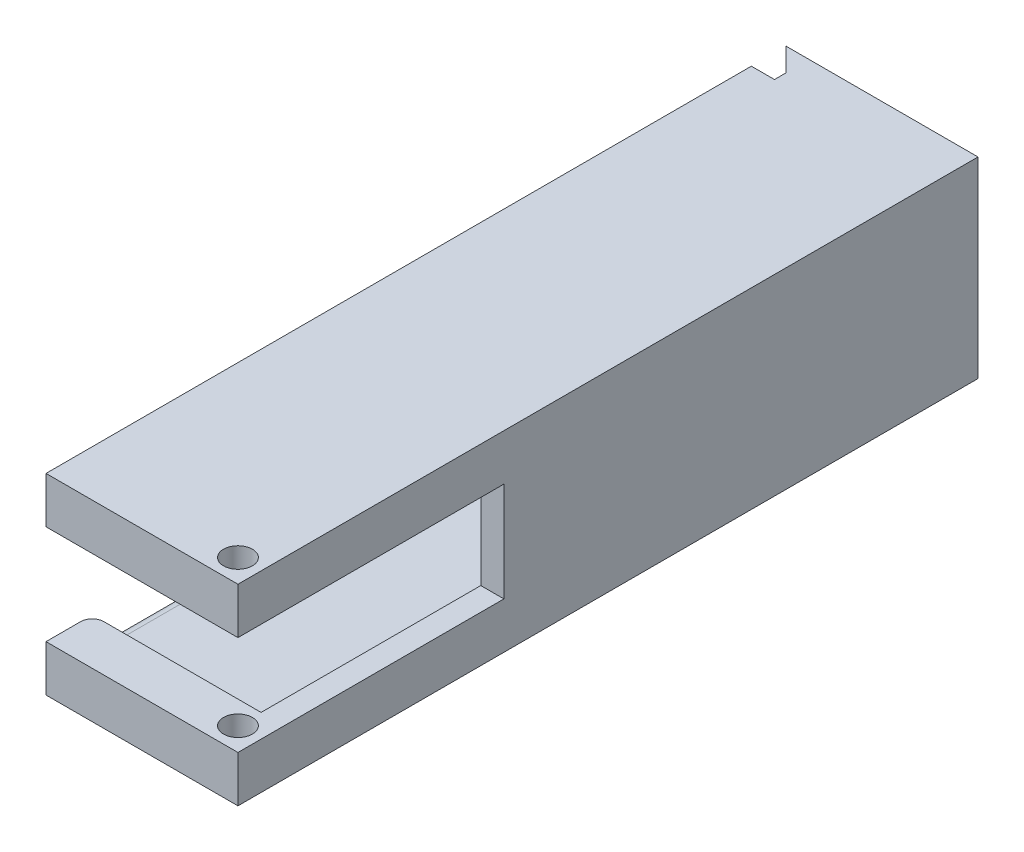
ISO-10303-21;
HEADER;
FILE_DESCRIPTION(('STEP AP214'),'2;1');
FILE_NAME('part.step','',(''),(''),'','','');
FILE_SCHEMA(('AUTOMOTIVE_DESIGN { 1 0 10303 214 1 1 1 1 }'));
ENDSEC;
DATA;
#1=APPLICATION_CONTEXT('core data for automotive mechanical design processes');
#2=APPLICATION_PROTOCOL_DEFINITION('international standard','automotive_design',2000,#1);
#3=PRODUCT_CONTEXT('',#1,'mechanical');
#4=PRODUCT('Part','Part','',(#3));
#5=PRODUCT_RELATED_PRODUCT_CATEGORY('part','',(#4));
#6=PRODUCT_DEFINITION_FORMATION('','',#4);
#7=PRODUCT_DEFINITION_CONTEXT('part definition',#1,'design');
#8=PRODUCT_DEFINITION('design','',#6,#7);
#9=PRODUCT_DEFINITION_SHAPE('','',#8);
#10=(LENGTH_UNIT() NAMED_UNIT(*) SI_UNIT(.MILLI.,.METRE.));
#11=(NAMED_UNIT(*) PLANE_ANGLE_UNIT() SI_UNIT($,.RADIAN.));
#12=(NAMED_UNIT(*) SI_UNIT($,.STERADIAN.) SOLID_ANGLE_UNIT());
#13=UNCERTAINTY_MEASURE_WITH_UNIT(LENGTH_MEASURE(1.E-05),#10,'distance_accuracy_value','');
#14=(GEOMETRIC_REPRESENTATION_CONTEXT(3) GLOBAL_UNCERTAINTY_ASSIGNED_CONTEXT((#13)) GLOBAL_UNIT_ASSIGNED_CONTEXT((#10,
#11,#12)) REPRESENTATION_CONTEXT('',''));
#15=CARTESIAN_POINT('',(0.,0.,0.));
#16=DIRECTION('',(0.,0.,1.));
#17=DIRECTION('',(1.,0.,0.));
#18=AXIS2_PLACEMENT_3D('',#15,#16,#17);
#19=CARTESIAN_POINT('',(0.,-2.,0.));
#20=DIRECTION('',(-1.,0.,0.));
#21=DIRECTION('',(0.,0.,1.));
#22=AXIS2_PLACEMENT_3D('',#19,#20,#21);
#23=PLANE('',#22);
#24=DIRECTION('',(0.,0.,1.));
#25=VECTOR('',#24,1.);
#26=CARTESIAN_POINT('',(0.,14.6,-60.));
#27=LINE('',#26,#25);
#28=CARTESIAN_POINT('',(0.,14.6,-57.));
#29=VERTEX_POINT('',#28);
#30=CARTESIAN_POINT('',(0.,14.6,4.));
#31=VERTEX_POINT('',#30);
#32=EDGE_CURVE('E280',#29,#31,#27,.T.);
#33=ORIENTED_EDGE('',*,*,#32,.F.);
#34=DIRECTION('',(0.,-1.,0.));
#35=VECTOR('',#34,1.);
#36=CARTESIAN_POINT('',(0.,19.,-57.));
#37=LINE('',#36,#35);
#38=CARTESIAN_POINT('',(0.,10.6,-57.));
#39=VERTEX_POINT('',#38);
#40=EDGE_CURVE('E619',#29,#39,#37,.T.);
#41=ORIENTED_EDGE('',*,*,#40,.T.);
#42=DIRECTION('',(0.,0.,-1.));
#43=VECTOR('',#42,1.);
#44=CARTESIAN_POINT('',(0.,10.6,0.));
#45=LINE('',#44,#43);
#46=CARTESIAN_POINT('',(0.,10.6,-20.999));
#47=VERTEX_POINT('',#46);
#48=EDGE_CURVE('E478',#47,#39,#45,.T.);
#49=ORIENTED_EDGE('',*,*,#48,.F.);
#50=CARTESIAN_POINT('',(0.,12.599,-20.999));
#51=DIRECTION('',(-1.,0.,0.));
#52=DIRECTION('',(0.,0.,1.));
#53=AXIS2_PLACEMENT_3D('',#50,#51,#52);
#54=CIRCLE('',#53,1.999);
#55=CARTESIAN_POINT('',(0.,12.599,-19.));
#56=VERTEX_POINT('',#55);
#57=EDGE_CURVE('E464',#56,#47,#54,.F.);
#58=ORIENTED_EDGE('',*,*,#57,.F.);
#59=DIRECTION('',(0.,-1.,0.));
#60=VECTOR('',#59,1.);
#61=CARTESIAN_POINT('',(0.,12.6,-19.));
#62=LINE('',#61,#60);
#63=CARTESIAN_POINT('',(0.,13.6,-19.));
#64=VERTEX_POINT('',#63);
#65=EDGE_CURVE('E555',#64,#56,#62,.T.);
#66=ORIENTED_EDGE('',*,*,#65,.F.);
#67=DIRECTION('',(0.,0.,1.));
#68=VECTOR('',#67,1.);
#69=CARTESIAN_POINT('',(0.,13.6,0.));
#70=LINE('',#69,#68);
#71=CARTESIAN_POINT('',(0.,13.6,1.));
#72=VERTEX_POINT('',#71);
#73=EDGE_CURVE('E331',#64,#72,#70,.T.);
#74=ORIENTED_EDGE('',*,*,#73,.T.);
#75=DIRECTION('',(0.,-1.,0.));
#76=VECTOR('',#75,1.);
#77=CARTESIAN_POINT('',(0.,-2.,1.));
#78=LINE('',#77,#76);
#79=CARTESIAN_POINT('',(0.,10.6,1.));
#80=VERTEX_POINT('',#79);
#81=EDGE_CURVE('E322',#72,#80,#78,.T.);
#82=ORIENTED_EDGE('',*,*,#81,.T.);
#83=DIRECTION('',(0.,0.,1.));
#84=VECTOR('',#83,1.);
#85=CARTESIAN_POINT('',(0.,10.6,0.));
#86=LINE('',#85,#84);
#87=CARTESIAN_POINT('',(0.,10.6,4.));
#88=VERTEX_POINT('',#87);
#89=EDGE_CURVE('E448',#80,#88,#86,.T.);
#90=ORIENTED_EDGE('',*,*,#89,.T.);
#91=DIRECTION('',(0.,-1.,0.));
#92=VECTOR('',#91,1.);
#93=CARTESIAN_POINT('',(0.,10.6,4.));
#94=LINE('',#93,#92);
#95=EDGE_CURVE('E400',#31,#88,#94,.T.);
#96=ORIENTED_EDGE('',*,*,#95,.F.);
#97=EDGE_LOOP('',(#33,#41,#49,#58,#66,#74,#82,#90,#96));
#98=FACE_BOUND('',#97,.T.);
#99=ADVANCED_FACE('F71',(#98),#23,.T.);
#100=DIRECTION('',(0.,0.,-1.));
#101=VECTOR('',#100,1.);
#102=CARTESIAN_POINT('',(0.,2.,0.));
#103=LINE('',#102,#101);
#104=CARTESIAN_POINT('',(0.,2.,-20.999));
#105=VERTEX_POINT('',#104);
#106=CARTESIAN_POINT('',(0.,1.99999999999999,-57.));
#107=VERTEX_POINT('',#106);
#108=EDGE_CURVE('E497',#105,#107,#103,.T.);
#109=ORIENTED_EDGE('',*,*,#108,.T.);
#110=CARTESIAN_POINT('',(0.,-2.,-57.));
#111=VERTEX_POINT('',#110);
#112=EDGE_CURVE('E605',#107,#111,#37,.T.);
#113=ORIENTED_EDGE('',*,*,#112,.T.);
#114=DIRECTION('',(0.,0.,1.));
#115=VECTOR('',#114,1.);
#116=CARTESIAN_POINT('',(0.,-2.,0.));
#117=LINE('',#116,#115);
#118=CARTESIAN_POINT('',(0.,-2.,4.));
#119=VERTEX_POINT('',#118);
#120=EDGE_CURVE('E307',#111,#119,#117,.T.);
#121=ORIENTED_EDGE('',*,*,#120,.T.);
#122=DIRECTION('',(0.,-1.,0.));
#123=VECTOR('',#122,1.);
#124=CARTESIAN_POINT('',(0.,-2.,4.));
#125=LINE('',#124,#123);
#126=CARTESIAN_POINT('',(0.,2.,4.));
#127=VERTEX_POINT('',#126);
#128=EDGE_CURVE('E424',#127,#119,#125,.T.);
#129=ORIENTED_EDGE('',*,*,#128,.F.);
#130=DIRECTION('',(0.,0.,1.));
#131=VECTOR('',#130,1.);
#132=CARTESIAN_POINT('',(0.,2.,0.));
#133=LINE('',#132,#131);
#134=CARTESIAN_POINT('',(0.,2.,1.));
#135=VERTEX_POINT('',#134);
#136=EDGE_CURVE('E458',#135,#127,#133,.T.);
#137=ORIENTED_EDGE('',*,*,#136,.F.);
#138=DIRECTION('',(0.,-1.,0.));
#139=VECTOR('',#138,1.);
#140=CARTESIAN_POINT('',(0.,-2.,1.));
#141=LINE('',#140,#139);
#142=CARTESIAN_POINT('',(0.,-1.,1.));
#143=VERTEX_POINT('',#142);
#144=EDGE_CURVE('E348',#135,#143,#141,.T.);
#145=ORIENTED_EDGE('',*,*,#144,.T.);
#146=DIRECTION('',(0.,0.,1.));
#147=VECTOR('',#146,1.);
#148=CARTESIAN_POINT('',(0.,-1.,0.));
#149=LINE('',#148,#147);
#150=CARTESIAN_POINT('',(0.,-1.,-19.));
#151=VERTEX_POINT('',#150);
#152=EDGE_CURVE('E344',#143,#151,#149,.F.);
#153=ORIENTED_EDGE('',*,*,#152,.T.);
#154=CARTESIAN_POINT('',(0.,0.000999999999972811,-19.));
#155=VERTEX_POINT('',#154);
#156=EDGE_CURVE('E554',#155,#151,#62,.T.);
#157=ORIENTED_EDGE('',*,*,#156,.F.);
#158=CARTESIAN_POINT('',(0.,0.000999999999987556,-20.999));
#159=DIRECTION('',(-1.,0.,0.));
#160=DIRECTION('',(0.,0.,1.));
#161=AXIS2_PLACEMENT_3D('',#158,#159,#160);
#162=CIRCLE('',#161,1.999);
#163=EDGE_CURVE('E470',#105,#155,#162,.F.);
#164=ORIENTED_EDGE('',*,*,#163,.F.);
#165=EDGE_LOOP('',(#109,#113,#121,#129,#137,#145,#153,#157,#164));
#166=FACE_BOUND('',#165,.T.);
#167=ADVANCED_FACE('F682',(#166),#23,.T.);
#168=CARTESIAN_POINT('',(2.00000000000004,12.6,0.));
#169=DIRECTION('',(-1.,0.,0.));
#170=DIRECTION('',(0.,0.,1.));
#171=AXIS2_PLACEMENT_3D('',#168,#169,#170);
#172=PLANE('',#171);
#173=DIRECTION('',(0.,-1.,0.));
#174=VECTOR('',#173,1.);
#175=CARTESIAN_POINT('',(2.,19.,-57.));
#176=LINE('',#175,#174);
#177=CARTESIAN_POINT('',(2.,1.99999999999999,-57.));
#178=VERTEX_POINT('',#177);
#179=CARTESIAN_POINT('',(2.,0.,-57.));
#180=VERTEX_POINT('',#179);
#181=EDGE_CURVE('E94',#178,#180,#176,.T.);
#182=ORIENTED_EDGE('',*,*,#181,.F.);
#183=DIRECTION('',(0.,0.,-1.));
#184=VECTOR('',#183,1.);
#185=CARTESIAN_POINT('',(2.,2.,0.));
#186=LINE('',#185,#184);
#187=CARTESIAN_POINT('',(1.99999999999997,2.,-20.999));
#188=VERTEX_POINT('',#187);
#189=EDGE_CURVE('E281',#188,#178,#186,.T.);
#190=ORIENTED_EDGE('',*,*,#189,.F.);
#191=CARTESIAN_POINT('',(1.99999999999997,0.000999999999987556,-20.999));
#192=DIRECTION('',(-1.,0.,0.));
#193=DIRECTION('',(0.,0.,1.));
#194=AXIS2_PLACEMENT_3D('',#191,#192,#193);
#195=CIRCLE('',#194,1.999);
#196=CARTESIAN_POINT('',(1.99999999999997,0.000999999999972811,-19.));
#197=VERTEX_POINT('',#196);
#198=EDGE_CURVE('E465',#188,#197,#195,.F.);
#199=ORIENTED_EDGE('',*,*,#198,.T.);
#200=DIRECTION('',(0.,-1.,0.));
#201=VECTOR('',#200,1.);
#202=CARTESIAN_POINT('',(2.00000000000003,12.6,-19.));
#203=LINE('',#202,#201);
#204=CARTESIAN_POINT('',(2.00000000000003,0.,-19.));
#205=VERTEX_POINT('',#204);
#206=EDGE_CURVE('E543',#197,#205,#203,.T.);
#207=ORIENTED_EDGE('',*,*,#206,.T.);
#208=DIRECTION('',(0.,0.,-1.));
#209=VECTOR('',#208,1.);
#210=CARTESIAN_POINT('',(2.00000000000004,0.,0.));
#211=LINE('',#210,#209);
#212=EDGE_CURVE('E539',#205,#180,#211,.T.);
#213=ORIENTED_EDGE('',*,*,#212,.T.);
#214=EDGE_LOOP('',(#182,#190,#199,#207,#213));
#215=FACE_BOUND('',#214,.T.);
#216=ADVANCED_FACE('F668',(#215),#172,.F.);
#217=CARTESIAN_POINT('',(2.,12.6,-57.));
#218=VERTEX_POINT('',#217);
#219=CARTESIAN_POINT('',(2.,10.6,-57.));
#220=VERTEX_POINT('',#219);
#221=EDGE_CURVE('E597',#218,#220,#176,.T.);
#222=ORIENTED_EDGE('',*,*,#221,.F.);
#223=DIRECTION('',(0.,0.,-1.));
#224=VECTOR('',#223,1.);
#225=CARTESIAN_POINT('',(2.00000000000004,12.6,0.));
#226=LINE('',#225,#224);
#227=CARTESIAN_POINT('',(2.00000000000003,12.6,-19.));
#228=VERTEX_POINT('',#227);
#229=EDGE_CURVE('E540',#228,#218,#226,.T.);
#230=ORIENTED_EDGE('',*,*,#229,.F.);
#231=CARTESIAN_POINT('',(1.99999999999997,12.599,-19.));
#232=VERTEX_POINT('',#231);
#233=EDGE_CURVE('E550',#228,#232,#203,.T.);
#234=ORIENTED_EDGE('',*,*,#233,.T.);
#235=CARTESIAN_POINT('',(1.99999999999997,12.599,-20.999));
#236=DIRECTION('',(-1.,0.,0.));
#237=DIRECTION('',(0.,0.,1.));
#238=AXIS2_PLACEMENT_3D('',#235,#236,#237);
#239=CIRCLE('',#238,1.999);
#240=CARTESIAN_POINT('',(1.99999999999997,10.6,-20.999));
#241=VERTEX_POINT('',#240);
#242=EDGE_CURVE('E481',#232,#241,#239,.F.);
#243=ORIENTED_EDGE('',*,*,#242,.T.);
#244=DIRECTION('',(0.,0.,-1.));
#245=VECTOR('',#244,1.);
#246=CARTESIAN_POINT('',(2.,10.6,0.));
#247=LINE('',#246,#245);
#248=EDGE_CURVE('E493',#241,#220,#247,.T.);
#249=ORIENTED_EDGE('',*,*,#248,.T.);
#250=EDGE_LOOP('',(#222,#230,#234,#243,#249));
#251=FACE_BOUND('',#250,.T.);
#252=ADVANCED_FACE('F596',(#251),#172,.F.);
#253=CARTESIAN_POINT('',(2.,10.6,0.));
#254=DIRECTION('',(0.,1.,0.));
#255=DIRECTION('',(0.,0.,1.));
#256=AXIS2_PLACEMENT_3D('',#253,#254,#255);
#257=PLANE('',#256);
#258=DIRECTION('',(-1.,0.,0.));
#259=VECTOR('',#258,1.);
#260=CARTESIAN_POINT('',(2.,10.6,-57.));
#261=LINE('',#260,#259);
#262=EDGE_CURVE('E371',#220,#39,#261,.T.);
#263=ORIENTED_EDGE('',*,*,#262,.F.);
#264=ORIENTED_EDGE('',*,*,#248,.F.);
#265=DIRECTION('',(-1.,0.,0.));
#266=VECTOR('',#265,1.);
#267=CARTESIAN_POINT('',(1.99999999999997,10.6,-20.999));
#268=LINE('',#267,#266);
#269=EDGE_CURVE('E473',#241,#47,#268,.T.);
#270=ORIENTED_EDGE('',*,*,#269,.T.);
#271=ORIENTED_EDGE('',*,*,#48,.T.);
#272=EDGE_LOOP('',(#263,#264,#270,#271));
#273=FACE_BOUND('',#272,.T.);
#274=ADVANCED_FACE('F954',(#273),#257,.F.);
#275=CARTESIAN_POINT('',(2.,2.,0.));
#276=DIRECTION('',(0.,1.,0.));
#277=DIRECTION('',(0.,0.,1.));
#278=AXIS2_PLACEMENT_3D('',#275,#276,#277);
#279=PLANE('',#278);
#280=ORIENTED_EDGE('',*,*,#189,.T.);
#281=DIRECTION('',(-1.,0.,0.));
#282=VECTOR('',#281,1.);
#283=CARTESIAN_POINT('',(2.,2.,-57.));
#284=LINE('',#283,#282);
#285=EDGE_CURVE('E379',#178,#107,#284,.T.);
#286=ORIENTED_EDGE('',*,*,#285,.T.);
#287=ORIENTED_EDGE('',*,*,#108,.F.);
#288=DIRECTION('',(-1.,0.,0.));
#289=VECTOR('',#288,1.);
#290=CARTESIAN_POINT('',(1.99999999999997,2.,-20.999));
#291=LINE('',#290,#289);
#292=EDGE_CURVE('E469',#188,#105,#291,.T.);
#293=ORIENTED_EDGE('',*,*,#292,.F.);
#294=EDGE_LOOP('',(#280,#286,#287,#293));
#295=FACE_BOUND('',#294,.T.);
#296=ADVANCED_FACE('F703',(#295),#279,.T.);
#297=CARTESIAN_POINT('',(0.,-2.,0.));
#298=DIRECTION('',(0.,1.,0.));
#299=DIRECTION('',(0.,0.,1.));
#300=AXIS2_PLACEMENT_3D('',#297,#298,#299);
#301=PLANE('',#300);
#302=CARTESIAN_POINT('',(14.6,-2.,2.));
#303=DIRECTION('',(0.,1.,0.));
#304=DIRECTION('',(0.,0.,1.));
#305=AXIS2_PLACEMENT_3D('',#302,#303,#304);
#306=CIRCLE('',#305,1.25);
#307=CARTESIAN_POINT('',(14.6,-2.,3.25));
#308=VERTEX_POINT('',#307);
#309=EDGE_CURVE('E396',#308,#308,#306,.T.);
#310=ORIENTED_EDGE('',*,*,#309,.T.);
#311=EDGE_LOOP('',(#310));
#312=FACE_BOUND('',#311,.T.);
#313=DIRECTION('',(1.,0.,0.));
#314=VECTOR('',#313,1.);
#315=CARTESIAN_POINT('',(0.,-2.,-57.));
#316=LINE('',#315,#314);
#317=CARTESIAN_POINT('',(2.,-2.,-57.));
#318=VERTEX_POINT('',#317);
#319=EDGE_CURVE('E615',#111,#318,#316,.T.);
#320=ORIENTED_EDGE('',*,*,#319,.T.);
#321=DIRECTION('',(0.,0.,1.));
#322=VECTOR('',#321,1.);
#323=CARTESIAN_POINT('',(2.00000000000001,-2.,0.));
#324=LINE('',#323,#322);
#325=CARTESIAN_POINT('',(2.,-2.,-57.999));
#326=VERTEX_POINT('',#325);
#327=EDGE_CURVE('E650',#326,#318,#324,.T.);
#328=ORIENTED_EDGE('',*,*,#327,.F.);
#329=DIRECTION('',(0.706930026593858,0.,0.707283491607154));
#330=VECTOR('',#329,1.);
#331=CARTESIAN_POINT('',(29.9999962518745,-2.,-29.9850037499996));
#332=LINE('',#331,#330);
#333=CARTESIAN_POINT('',(0.,-2.,-60.));
#334=VERTEX_POINT('',#333);
#335=EDGE_CURVE('E293',#334,#326,#332,.T.);
#336=ORIENTED_EDGE('',*,*,#335,.F.);
#337=DIRECTION('',(1.,0.,0.));
#338=VECTOR('',#337,1.);
#339=CARTESIAN_POINT('',(0.,-2.,-60.));
#340=LINE('',#339,#338);
#341=CARTESIAN_POINT('',(16.6,-2.,-60.));
#342=VERTEX_POINT('',#341);
#343=EDGE_CURVE('E559',#334,#342,#340,.T.);
#344=ORIENTED_EDGE('',*,*,#343,.T.);
#345=DIRECTION('',(0.,0.,1.));
#346=VECTOR('',#345,1.);
#347=CARTESIAN_POINT('',(16.6,-2.,0.));
#348=LINE('',#347,#346);
#349=CARTESIAN_POINT('',(16.6,-2.,4.));
#350=VERTEX_POINT('',#349);
#351=EDGE_CURVE('E301',#342,#350,#348,.T.);
#352=ORIENTED_EDGE('',*,*,#351,.T.);
#353=DIRECTION('',(1.,0.,0.));
#354=VECTOR('',#353,1.);
#355=CARTESIAN_POINT('',(16.6,-2.,4.));
#356=LINE('',#355,#354);
#357=EDGE_CURVE('E428',#119,#350,#356,.T.);
#358=ORIENTED_EDGE('',*,*,#357,.F.);
#359=ORIENTED_EDGE('',*,*,#120,.F.);
#360=EDGE_LOOP('',(#320,#328,#336,#344,#352,#358,#359));
#361=FACE_BOUND('',#360,.T.);
#362=ADVANCED_FACE('F646',(#312,#361),#301,.F.);
#363=CARTESIAN_POINT('',(0.,14.6,0.));
#364=DIRECTION('',(0.,1.,0.));
#365=DIRECTION('',(0.,0.,1.));
#366=AXIS2_PLACEMENT_3D('',#363,#364,#365);
#367=PLANE('',#366);
#368=CARTESIAN_POINT('',(14.6,14.6,2.));
#369=DIRECTION('',(0.,1.,0.));
#370=DIRECTION('',(0.,0.,1.));
#371=AXIS2_PLACEMENT_3D('',#368,#369,#370);
#372=CIRCLE('',#371,1.25);
#373=CARTESIAN_POINT('',(14.6,14.6,3.25));
#374=VERTEX_POINT('',#373);
#375=EDGE_CURVE('E328',#374,#374,#372,.T.);
#376=ORIENTED_EDGE('',*,*,#375,.F.);
#377=EDGE_LOOP('',(#376));
#378=FACE_BOUND('',#377,.T.);
#379=DIRECTION('',(0.,0.,-1.));
#380=VECTOR('',#379,1.);
#381=CARTESIAN_POINT('',(2.00000000000001,14.6,0.));
#382=LINE('',#381,#380);
#383=CARTESIAN_POINT('',(2.,14.6,-57.));
#384=VERTEX_POINT('',#383);
#385=CARTESIAN_POINT('',(2.,14.6,-57.999));
#386=VERTEX_POINT('',#385);
#387=EDGE_CURVE('E618',#384,#386,#382,.T.);
#388=ORIENTED_EDGE('',*,*,#387,.F.);
#389=DIRECTION('',(-1.,0.,0.));
#390=VECTOR('',#389,1.);
#391=CARTESIAN_POINT('',(0.,14.6,-57.));
#392=LINE('',#391,#390);
#393=EDGE_CURVE('E386',#384,#29,#392,.T.);
#394=ORIENTED_EDGE('',*,*,#393,.T.);
#395=ORIENTED_EDGE('',*,*,#32,.T.);
#396=DIRECTION('',(-1.,0.,0.));
#397=VECTOR('',#396,1.);
#398=CARTESIAN_POINT('',(0.,14.6,4.));
#399=LINE('',#398,#397);
#400=CARTESIAN_POINT('',(16.6,14.6,4.));
#401=VERTEX_POINT('',#400);
#402=EDGE_CURVE('E412',#401,#31,#399,.T.);
#403=ORIENTED_EDGE('',*,*,#402,.F.);
#404=DIRECTION('',(0.,0.,-1.));
#405=VECTOR('',#404,1.);
#406=CARTESIAN_POINT('',(16.6,14.6,-60.));
#407=LINE('',#406,#405);
#408=CARTESIAN_POINT('',(16.6,14.6,-60.));
#409=VERTEX_POINT('',#408);
#410=EDGE_CURVE('E508',#401,#409,#407,.T.);
#411=ORIENTED_EDGE('',*,*,#410,.T.);
#412=DIRECTION('',(-1.,0.,0.));
#413=VECTOR('',#412,1.);
#414=CARTESIAN_POINT('',(0.,14.6,-60.));
#415=LINE('',#414,#413);
#416=CARTESIAN_POINT('',(0.,14.6,-60.));
#417=VERTEX_POINT('',#416);
#418=EDGE_CURVE('E512',#409,#417,#415,.T.);
#419=ORIENTED_EDGE('',*,*,#418,.T.);
#420=DIRECTION('',(-0.706930026593858,0.,-0.707283491607154));
#421=VECTOR('',#420,1.);
#422=CARTESIAN_POINT('',(29.9999962518745,14.6,-29.9850037499996));
#423=LINE('',#422,#421);
#424=EDGE_CURVE('E297',#386,#417,#423,.T.);
#425=ORIENTED_EDGE('',*,*,#424,.F.);
#426=EDGE_LOOP('',(#388,#394,#395,#403,#411,#419,#425));
#427=FACE_BOUND('',#426,.T.);
#428=ADVANCED_FACE('F629',(#378,#427),#367,.T.);
#429=CARTESIAN_POINT('',(0.,12.6,0.));
#430=DIRECTION('',(0.,0.,-1.));
#431=DIRECTION('',(-1.,0.,0.));
#432=AXIS2_PLACEMENT_3D('',#429,#430,#431);
#433=PLANE('',#432);
#434=DIRECTION('',(-1.,0.,0.));
#435=VECTOR('',#434,1.);
#436=CARTESIAN_POINT('',(0.,10.6,0.));
#437=LINE('',#436,#435);
#438=CARTESIAN_POINT('',(14.6,10.6,0.));
#439=VERTEX_POINT('',#438);
#440=CARTESIAN_POINT('',(1.,10.6,0.));
#441=VERTEX_POINT('',#440);
#442=EDGE_CURVE('E444',#439,#441,#437,.T.);
#443=ORIENTED_EDGE('',*,*,#442,.T.);
#444=DIRECTION('',(0.,-1.,0.));
#445=VECTOR('',#444,1.);
#446=CARTESIAN_POINT('',(1.,12.6,0.));
#447=LINE('',#446,#445);
#448=CARTESIAN_POINT('',(1.,12.6,0.));
#449=VERTEX_POINT('',#448);
#450=EDGE_CURVE('E341',#441,#449,#447,.F.);
#451=ORIENTED_EDGE('',*,*,#450,.T.);
#452=DIRECTION('',(1.,0.,0.));
#453=VECTOR('',#452,1.);
#454=CARTESIAN_POINT('',(0.,12.6,0.));
#455=LINE('',#454,#453);
#456=CARTESIAN_POINT('',(14.6,12.6,0.));
#457=VERTEX_POINT('',#456);
#458=EDGE_CURVE('E516',#449,#457,#455,.T.);
#459=ORIENTED_EDGE('',*,*,#458,.T.);
#460=DIRECTION('',(0.,-1.,0.));
#461=VECTOR('',#460,1.);
#462=CARTESIAN_POINT('',(14.6,12.6,0.));
#463=LINE('',#462,#461);
#464=EDGE_CURVE('E528',#457,#439,#463,.T.);
#465=ORIENTED_EDGE('',*,*,#464,.T.);
#466=EDGE_LOOP('',(#443,#451,#459,#465));
#467=FACE_BOUND('',#466,.T.);
#468=ADVANCED_FACE('F909',(#467),#433,.T.);
#469=CARTESIAN_POINT('',(0.,12.6,-19.));
#470=DIRECTION('',(0.,0.,1.));
#471=DIRECTION('',(1.,0.,0.));
#472=AXIS2_PLACEMENT_3D('',#469,#470,#471);
#473=PLANE('',#472);
#474=ORIENTED_EDGE('',*,*,#65,.T.);
#475=DIRECTION('',(-1.,0.,0.));
#476=VECTOR('',#475,1.);
#477=CARTESIAN_POINT('',(1.99999999999997,12.599,-19.));
#478=LINE('',#477,#476);
#479=EDGE_CURVE('E485',#232,#56,#478,.T.);
#480=ORIENTED_EDGE('',*,*,#479,.F.);
#481=ORIENTED_EDGE('',*,*,#233,.F.);
#482=DIRECTION('',(-1.,0.,0.));
#483=VECTOR('',#482,1.);
#484=CARTESIAN_POINT('',(0.,12.6,-19.));
#485=LINE('',#484,#483);
#486=CARTESIAN_POINT('',(0.999999999999973,12.6,-19.));
#487=VERTEX_POINT('',#486);
#488=EDGE_CURVE('E535',#228,#487,#485,.T.);
#489=ORIENTED_EDGE('',*,*,#488,.T.);
#490=CARTESIAN_POINT('',(0.999999999999973,13.6,-19.));
#491=DIRECTION('',(0.,0.,1.));
#492=DIRECTION('',(1.,0.,0.));
#493=AXIS2_PLACEMENT_3D('',#490,#491,#492);
#494=CIRCLE('',#493,1.);
#495=EDGE_CURVE('E361',#487,#64,#494,.F.);
#496=ORIENTED_EDGE('',*,*,#495,.T.);
#497=EDGE_LOOP('',(#474,#480,#481,#489,#496));
#498=FACE_BOUND('',#497,.T.);
#499=ADVANCED_FACE('F592',(#498),#473,.T.);
#500=CARTESIAN_POINT('',(0.,-2.,-60.));
#501=DIRECTION('',(0.,0.,1.));
#502=DIRECTION('',(1.,0.,0.));
#503=AXIS2_PLACEMENT_3D('',#500,#501,#502);
#504=PLANE('',#503);
#505=DIRECTION('',(-1.,0.,0.));
#506=VECTOR('',#505,1.);
#507=CARTESIAN_POINT('',(0.,12.6,-60.));
#508=LINE('',#507,#506);
#509=CARTESIAN_POINT('',(14.6,12.6,-60.));
#510=VERTEX_POINT('',#509);
#511=CARTESIAN_POINT('',(0.,12.6,-60.));
#512=VERTEX_POINT('',#511);
#513=EDGE_CURVE('E267',#510,#512,#508,.T.);
#514=ORIENTED_EDGE('',*,*,#513,.T.);
#515=DIRECTION('',(0.,1.,0.));
#516=VECTOR('',#515,1.);
#517=CARTESIAN_POINT('',(0.,-2.,-60.));
#518=LINE('',#517,#516);
#519=EDGE_CURVE('E272',#512,#417,#518,.T.);
#520=ORIENTED_EDGE('',*,*,#519,.T.);
#521=ORIENTED_EDGE('',*,*,#418,.F.);
#522=DIRECTION('',(0.,1.,0.));
#523=VECTOR('',#522,1.);
#524=CARTESIAN_POINT('',(16.6,-2.,-60.));
#525=LINE('',#524,#523);
#526=EDGE_CURVE('E306',#342,#409,#525,.T.);
#527=ORIENTED_EDGE('',*,*,#526,.F.);
#528=ORIENTED_EDGE('',*,*,#343,.F.);
#529=CARTESIAN_POINT('',(0.,0.,-60.));
#530=VERTEX_POINT('',#529);
#531=EDGE_CURVE('E300',#334,#530,#518,.T.);
#532=ORIENTED_EDGE('',*,*,#531,.T.);
#533=DIRECTION('',(1.,0.,0.));
#534=VECTOR('',#533,1.);
#535=CARTESIAN_POINT('',(0.,0.,-60.));
#536=LINE('',#535,#534);
#537=CARTESIAN_POINT('',(14.6,0.,-60.));
#538=VERTEX_POINT('',#537);
#539=EDGE_CURVE('E87',#530,#538,#536,.T.);
#540=ORIENTED_EDGE('',*,*,#539,.T.);
#541=DIRECTION('',(0.,-1.,0.));
#542=VECTOR('',#541,1.);
#543=CARTESIAN_POINT('',(14.6,12.6,-60.));
#544=LINE('',#543,#542);
#545=EDGE_CURVE('E275',#510,#538,#544,.T.);
#546=ORIENTED_EDGE('',*,*,#545,.F.);
#547=EDGE_LOOP('',(#514,#520,#521,#527,#528,#532,#540,#546));
#548=FACE_BOUND('',#547,.T.);
#549=ADVANCED_FACE('F269',(#548),#504,.F.);
#550=DIRECTION('',(-1.,0.,0.));
#551=VECTOR('',#550,1.);
#552=CARTESIAN_POINT('',(1.99999999999997,0.000999999999972811,-19.));
#553=LINE('',#552,#551);
#554=EDGE_CURVE('E474',#197,#155,#553,.T.);
#555=ORIENTED_EDGE('',*,*,#554,.T.);
#556=ORIENTED_EDGE('',*,*,#156,.T.);
#557=CARTESIAN_POINT('',(0.999999999999973,-1.,-19.));
#558=DIRECTION('',(0.,0.,1.));
#559=DIRECTION('',(1.,0.,0.));
#560=AXIS2_PLACEMENT_3D('',#557,#558,#559);
#561=CIRCLE('',#560,1.);
#562=CARTESIAN_POINT('',(0.999999999999973,0.,-19.));
#563=VERTEX_POINT('',#562);
#564=EDGE_CURVE('E80',#151,#563,#561,.F.);
#565=ORIENTED_EDGE('',*,*,#564,.T.);
#566=DIRECTION('',(-1.,0.,0.));
#567=VECTOR('',#566,1.);
#568=CARTESIAN_POINT('',(0.,0.,-19.));
#569=LINE('',#568,#567);
#570=EDGE_CURVE('E534',#205,#563,#569,.T.);
#571=ORIENTED_EDGE('',*,*,#570,.F.);
#572=ORIENTED_EDGE('',*,*,#206,.F.);
#573=EDGE_LOOP('',(#555,#556,#565,#571,#572));
#574=FACE_BOUND('',#573,.T.);
#575=ADVANCED_FACE('F674',(#574),#473,.T.);
#576=CARTESIAN_POINT('',(16.6,-2.,0.));
#577=DIRECTION('',(-1.,0.,0.));
#578=DIRECTION('',(0.,0.,1.));
#579=AXIS2_PLACEMENT_3D('',#576,#577,#578);
#580=PLANE('',#579);
#581=DIRECTION('',(0.,-1.,0.));
#582=VECTOR('',#581,1.);
#583=CARTESIAN_POINT('',(16.6,-2.,-19.));
#584=LINE('',#583,#582);
#585=CARTESIAN_POINT('',(16.6,10.6,-19.));
#586=VERTEX_POINT('',#585);
#587=CARTESIAN_POINT('',(16.6,2.,-19.));
#588=VERTEX_POINT('',#587);
#589=EDGE_CURVE('E440',#586,#588,#584,.T.);
#590=ORIENTED_EDGE('',*,*,#589,.T.);
#591=DIRECTION('',(0.,0.,1.));
#592=VECTOR('',#591,1.);
#593=CARTESIAN_POINT('',(16.6,2.,0.));
#594=LINE('',#593,#592);
#595=CARTESIAN_POINT('',(16.6,2.,4.));
#596=VERTEX_POINT('',#595);
#597=EDGE_CURVE('E461',#588,#596,#594,.T.);
#598=ORIENTED_EDGE('',*,*,#597,.T.);
#599=DIRECTION('',(0.,1.,0.));
#600=VECTOR('',#599,1.);
#601=CARTESIAN_POINT('',(16.6,-2.,4.));
#602=LINE('',#601,#600);
#603=EDGE_CURVE('E416',#350,#596,#602,.T.);
#604=ORIENTED_EDGE('',*,*,#603,.F.);
#605=ORIENTED_EDGE('',*,*,#351,.F.);
#606=ORIENTED_EDGE('',*,*,#526,.T.);
#607=ORIENTED_EDGE('',*,*,#410,.F.);
#608=DIRECTION('',(0.,1.,0.));
#609=VECTOR('',#608,1.);
#610=CARTESIAN_POINT('',(16.6,10.6,4.));
#611=LINE('',#610,#609);
#612=CARTESIAN_POINT('',(16.6,10.6,4.));
#613=VERTEX_POINT('',#612);
#614=EDGE_CURVE('E408',#613,#401,#611,.T.);
#615=ORIENTED_EDGE('',*,*,#614,.F.);
#616=DIRECTION('',(0.,0.,1.));
#617=VECTOR('',#616,1.);
#618=CARTESIAN_POINT('',(16.6,10.6,0.));
#619=LINE('',#618,#617);
#620=EDGE_CURVE('E451',#586,#613,#619,.T.);
#621=ORIENTED_EDGE('',*,*,#620,.F.);
#622=EDGE_LOOP('',(#590,#598,#604,#605,#606,#607,#615,#621));
#623=FACE_BOUND('',#622,.T.);
#624=ADVANCED_FACE('F640',(#623),#580,.F.);
#625=CARTESIAN_POINT('',(0.,0.,0.));
#626=DIRECTION('',(0.,1.,0.));
#627=DIRECTION('',(0.,0.,1.));
#628=AXIS2_PLACEMENT_3D('',#625,#626,#627);
#629=PLANE('',#628);
#630=ORIENTED_EDGE('',*,*,#570,.T.);
#631=DIRECTION('',(0.,0.,1.));
#632=VECTOR('',#631,1.);
#633=CARTESIAN_POINT('',(1.,0.,0.));
#634=LINE('',#633,#632);
#635=CARTESIAN_POINT('',(1.,0.,0.));
#636=VERTEX_POINT('',#635);
#637=EDGE_CURVE('E358',#563,#636,#634,.T.);
#638=ORIENTED_EDGE('',*,*,#637,.T.);
#639=DIRECTION('',(1.,0.,0.));
#640=VECTOR('',#639,1.);
#641=CARTESIAN_POINT('',(0.,0.,0.));
#642=LINE('',#641,#640);
#643=CARTESIAN_POINT('',(14.6,0.,0.));
#644=VERTEX_POINT('',#643);
#645=EDGE_CURVE('E514',#636,#644,#642,.T.);
#646=ORIENTED_EDGE('',*,*,#645,.T.);
#647=DIRECTION('',(0.,0.,-1.));
#648=VECTOR('',#647,1.);
#649=CARTESIAN_POINT('',(14.6,0.,0.));
#650=LINE('',#649,#648);
#651=EDGE_CURVE('E520',#644,#538,#650,.T.);
#652=ORIENTED_EDGE('',*,*,#651,.T.);
#653=ORIENTED_EDGE('',*,*,#539,.F.);
#654=DIRECTION('',(-0.706930026593858,0.,-0.707283491607154));
#655=VECTOR('',#654,1.);
#656=CARTESIAN_POINT('',(29.9999962518745,0.,-29.9850037499996));
#657=LINE('',#656,#655);
#658=CARTESIAN_POINT('',(1.99999999999991,0.,-57.9990000000001));
#659=VERTEX_POINT('',#658);
#660=EDGE_CURVE('E12',#659,#530,#657,.T.);
#661=ORIENTED_EDGE('',*,*,#660,.F.);
#662=DIRECTION('',(0.,0.,-1.));
#663=VECTOR('',#662,1.);
#664=CARTESIAN_POINT('',(2.00000000000001,0.,0.));
#665=LINE('',#664,#663);
#666=EDGE_CURVE('E622',#180,#659,#665,.T.);
#667=ORIENTED_EDGE('',*,*,#666,.F.);
#668=ORIENTED_EDGE('',*,*,#212,.F.);
#669=EDGE_LOOP('',(#630,#638,#646,#652,#653,#661,#667,#668));
#670=FACE_BOUND('',#669,.T.);
#671=ADVANCED_FACE('F665',(#670),#629,.T.);
#672=ORIENTED_EDGE('',*,*,#645,.F.);
#673=DIRECTION('',(0.,-1.,0.));
#674=VECTOR('',#673,1.);
#675=CARTESIAN_POINT('',(1.,12.6,0.));
#676=LINE('',#675,#674);
#677=CARTESIAN_POINT('',(1.,2.,0.));
#678=VERTEX_POINT('',#677);
#679=EDGE_CURVE('E352',#636,#678,#676,.F.);
#680=ORIENTED_EDGE('',*,*,#679,.T.);
#681=DIRECTION('',(-1.,0.,0.));
#682=VECTOR('',#681,1.);
#683=CARTESIAN_POINT('',(0.,2.,0.));
#684=LINE('',#683,#682);
#685=CARTESIAN_POINT('',(14.6,2.,0.));
#686=VERTEX_POINT('',#685);
#687=EDGE_CURVE('E454',#686,#678,#684,.T.);
#688=ORIENTED_EDGE('',*,*,#687,.F.);
#689=EDGE_CURVE('E523',#686,#644,#463,.T.);
#690=ORIENTED_EDGE('',*,*,#689,.T.);
#691=EDGE_LOOP('',(#672,#680,#688,#690));
#692=FACE_BOUND('',#691,.T.);
#693=ADVANCED_FACE('F693',(#692),#433,.T.);
#694=CARTESIAN_POINT('',(14.6,12.6,0.));
#695=DIRECTION('',(-1.,0.,0.));
#696=DIRECTION('',(0.,0.,1.));
#697=AXIS2_PLACEMENT_3D('',#694,#695,#696);
#698=PLANE('',#697);
#699=DIRECTION('',(0.,0.,1.));
#700=VECTOR('',#699,1.);
#701=CARTESIAN_POINT('',(14.6,2.,0.));
#702=LINE('',#701,#700);
#703=CARTESIAN_POINT('',(14.6,2.,-19.));
#704=VERTEX_POINT('',#703);
#705=EDGE_CURVE('E319',#704,#686,#702,.T.);
#706=ORIENTED_EDGE('',*,*,#705,.F.);
#707=DIRECTION('',(0.,-1.,0.));
#708=VECTOR('',#707,1.);
#709=CARTESIAN_POINT('',(14.6,12.6,-19.));
#710=LINE('',#709,#708);
#711=CARTESIAN_POINT('',(14.6,10.6,-19.));
#712=VERTEX_POINT('',#711);
#713=EDGE_CURVE('E312',#712,#704,#710,.T.);
#714=ORIENTED_EDGE('',*,*,#713,.F.);
#715=DIRECTION('',(0.,0.,1.));
#716=VECTOR('',#715,1.);
#717=CARTESIAN_POINT('',(14.6,10.6,0.));
#718=LINE('',#717,#716);
#719=EDGE_CURVE('E315',#712,#439,#718,.T.);
#720=ORIENTED_EDGE('',*,*,#719,.T.);
#721=ORIENTED_EDGE('',*,*,#464,.F.);
#722=DIRECTION('',(0.,0.,-1.));
#723=VECTOR('',#722,1.);
#724=CARTESIAN_POINT('',(14.6,12.6,0.));
#725=LINE('',#724,#723);
#726=EDGE_CURVE('E519',#457,#510,#725,.T.);
#727=ORIENTED_EDGE('',*,*,#726,.T.);
#728=ORIENTED_EDGE('',*,*,#545,.T.);
#729=ORIENTED_EDGE('',*,*,#651,.F.);
#730=ORIENTED_EDGE('',*,*,#689,.F.);
#731=EDGE_LOOP('',(#706,#714,#720,#721,#727,#728,#729,#730));
#732=FACE_BOUND('',#731,.T.);
#733=ADVANCED_FACE('F569',(#732),#698,.T.);
#734=CARTESIAN_POINT('',(0.,12.6,0.));
#735=DIRECTION('',(0.,1.,0.));
#736=DIRECTION('',(0.,0.,1.));
#737=AXIS2_PLACEMENT_3D('',#734,#735,#736);
#738=PLANE('',#737);
#739=ORIENTED_EDGE('',*,*,#458,.F.);
#740=DIRECTION('',(0.,0.,1.));
#741=VECTOR('',#740,1.);
#742=CARTESIAN_POINT('',(0.999999999999973,12.6,-19.));
#743=LINE('',#742,#741);
#744=EDGE_CURVE('E335',#449,#487,#743,.F.);
#745=ORIENTED_EDGE('',*,*,#744,.T.);
#746=ORIENTED_EDGE('',*,*,#488,.F.);
#747=ORIENTED_EDGE('',*,*,#229,.T.);
#748=CARTESIAN_POINT('',(2.,12.6,-57.999));
#749=VERTEX_POINT('',#748);
#750=EDGE_CURVE('E288',#218,#749,#226,.T.);
#751=ORIENTED_EDGE('',*,*,#750,.T.);
#752=DIRECTION('',(0.706930026593858,0.,0.707283491607154));
#753=VECTOR('',#752,1.);
#754=CARTESIAN_POINT('',(29.9999962518745,12.6,-29.9850037499996));
#755=LINE('',#754,#753);
#756=EDGE_CURVE('E284',#512,#749,#755,.T.);
#757=ORIENTED_EDGE('',*,*,#756,.F.);
#758=ORIENTED_EDGE('',*,*,#513,.F.);
#759=ORIENTED_EDGE('',*,*,#726,.F.);
#760=EDGE_LOOP('',(#739,#745,#746,#747,#751,#757,#758,#759));
#761=FACE_BOUND('',#760,.T.);
#762=ADVANCED_FACE('F286',(#761),#738,.F.);
#763=CARTESIAN_POINT('',(1.99999999999997,0.000999999999987556,-20.999));
#764=DIRECTION('',(-1.,0.,0.));
#765=DIRECTION('',(0.,0.,1.));
#766=AXIS2_PLACEMENT_3D('',#763,#764,#765);
#767=CYLINDRICAL_SURFACE('',#766,1.999);
#768=ORIENTED_EDGE('',*,*,#163,.T.);
#769=ORIENTED_EDGE('',*,*,#554,.F.);
#770=ORIENTED_EDGE('',*,*,#198,.F.);
#771=ORIENTED_EDGE('',*,*,#292,.T.);
#772=EDGE_LOOP('',(#768,#769,#770,#771));
#773=FACE_BOUND('',#772,.T.);
#774=ADVANCED_FACE('F704',(#773),#767,.T.);
#775=CARTESIAN_POINT('',(1.99999999999997,12.599,-20.999));
#776=DIRECTION('',(-1.,0.,0.));
#777=DIRECTION('',(0.,0.,1.));
#778=AXIS2_PLACEMENT_3D('',#775,#776,#777);
#779=CYLINDRICAL_SURFACE('',#778,1.999);
#780=ORIENTED_EDGE('',*,*,#57,.T.);
#781=ORIENTED_EDGE('',*,*,#269,.F.);
#782=ORIENTED_EDGE('',*,*,#242,.F.);
#783=ORIENTED_EDGE('',*,*,#479,.T.);
#784=EDGE_LOOP('',(#780,#781,#782,#783));
#785=FACE_BOUND('',#784,.T.);
#786=ADVANCED_FACE('F706',(#785),#779,.T.);
#787=CARTESIAN_POINT('',(-2.89999999999998,2.,0.));
#788=DIRECTION('',(0.,-1.,0.));
#789=DIRECTION('',(0.,0.,-1.));
#790=AXIS2_PLACEMENT_3D('',#787,#788,#789);
#791=PLANE('',#790);
#792=CARTESIAN_POINT('',(14.6,2.,2.));
#793=DIRECTION('',(0.,-1.,0.));
#794=DIRECTION('',(0.,0.,-1.));
#795=AXIS2_PLACEMENT_3D('',#792,#793,#794);
#796=CIRCLE('',#795,1.25);
#797=CARTESIAN_POINT('',(14.6,2.,0.750000000000002));
#798=VERTEX_POINT('',#797);
#799=EDGE_CURVE('E327',#798,#798,#796,.T.);
#800=ORIENTED_EDGE('',*,*,#799,.T.);
#801=EDGE_LOOP('',(#800));
#802=FACE_BOUND('',#801,.T.);
#803=ORIENTED_EDGE('',*,*,#687,.T.);
#804=CARTESIAN_POINT('',(1.,2.,1.));
#805=DIRECTION('',(0.,-1.,0.));
#806=DIRECTION('',(0.,0.,-1.));
#807=AXIS2_PLACEMENT_3D('',#804,#805,#806);
#808=CIRCLE('',#807,1.);
#809=EDGE_CURVE('E355',#678,#135,#808,.F.);
#810=ORIENTED_EDGE('',*,*,#809,.T.);
#811=ORIENTED_EDGE('',*,*,#136,.T.);
#812=DIRECTION('',(-1.,0.,0.));
#813=VECTOR('',#812,1.);
#814=CARTESIAN_POINT('',(16.6,2.,4.));
#815=LINE('',#814,#813);
#816=EDGE_CURVE('E420',#596,#127,#815,.T.);
#817=ORIENTED_EDGE('',*,*,#816,.F.);
#818=ORIENTED_EDGE('',*,*,#597,.F.);
#819=DIRECTION('',(1.,0.,0.));
#820=VECTOR('',#819,1.);
#821=CARTESIAN_POINT('',(-2.89999999999998,2.,-19.));
#822=LINE('',#821,#820);
#823=EDGE_CURVE('E432',#704,#588,#822,.T.);
#824=ORIENTED_EDGE('',*,*,#823,.F.);
#825=ORIENTED_EDGE('',*,*,#705,.T.);
#826=EDGE_LOOP('',(#803,#810,#811,#817,#818,#824,#825));
#827=FACE_BOUND('',#826,.T.);
#828=ADVANCED_FACE('F687',(#802,#827),#791,.F.);
#829=CARTESIAN_POINT('',(-2.89999999999998,10.6,0.));
#830=DIRECTION('',(0.,-1.,0.));
#831=DIRECTION('',(0.,0.,-1.));
#832=AXIS2_PLACEMENT_3D('',#829,#830,#831);
#833=PLANE('',#832);
#834=CARTESIAN_POINT('',(14.6,10.6,2.));
#835=DIRECTION('',(0.,-1.,0.));
#836=DIRECTION('',(0.,0.,-1.));
#837=AXIS2_PLACEMENT_3D('',#834,#835,#836);
#838=CIRCLE('',#837,1.25);
#839=CARTESIAN_POINT('',(14.6,10.6,0.750000000000002));
#840=VERTEX_POINT('',#839);
#841=EDGE_CURVE('E323',#840,#840,#838,.T.);
#842=ORIENTED_EDGE('',*,*,#841,.F.);
#843=EDGE_LOOP('',(#842));
#844=FACE_BOUND('',#843,.T.);
#845=ORIENTED_EDGE('',*,*,#89,.F.);
#846=CARTESIAN_POINT('',(1.,10.6,1.));
#847=DIRECTION('',(0.,-1.,0.));
#848=DIRECTION('',(0.,0.,-1.));
#849=AXIS2_PLACEMENT_3D('',#846,#847,#848);
#850=CIRCLE('',#849,1.);
#851=EDGE_CURVE('E338',#80,#441,#850,.T.);
#852=ORIENTED_EDGE('',*,*,#851,.T.);
#853=ORIENTED_EDGE('',*,*,#442,.F.);
#854=ORIENTED_EDGE('',*,*,#719,.F.);
#855=DIRECTION('',(1.,0.,0.));
#856=VECTOR('',#855,1.);
#857=CARTESIAN_POINT('',(-2.89999999999998,10.6,-19.));
#858=LINE('',#857,#856);
#859=EDGE_CURVE('E436',#712,#586,#858,.T.);
#860=ORIENTED_EDGE('',*,*,#859,.T.);
#861=ORIENTED_EDGE('',*,*,#620,.T.);
#862=DIRECTION('',(1.,0.,0.));
#863=VECTOR('',#862,1.);
#864=CARTESIAN_POINT('',(0.,10.6,4.));
#865=LINE('',#864,#863);
#866=EDGE_CURVE('E404',#88,#613,#865,.T.);
#867=ORIENTED_EDGE('',*,*,#866,.F.);
#868=EDGE_LOOP('',(#845,#852,#853,#854,#860,#861,#867));
#869=FACE_BOUND('',#868,.T.);
#870=ADVANCED_FACE('F786',(#844,#869),#833,.T.);
#871=CARTESIAN_POINT('',(-2.89999999999998,0.,-19.));
#872=DIRECTION('',(0.,0.,-1.));
#873=DIRECTION('',(-1.,0.,0.));
#874=AXIS2_PLACEMENT_3D('',#871,#872,#873);
#875=PLANE('',#874);
#876=ORIENTED_EDGE('',*,*,#859,.F.);
#877=ORIENTED_EDGE('',*,*,#713,.T.);
#878=ORIENTED_EDGE('',*,*,#823,.T.);
#879=ORIENTED_EDGE('',*,*,#589,.F.);
#880=EDGE_LOOP('',(#876,#877,#878,#879));
#881=FACE_BOUND('',#880,.T.);
#882=ADVANCED_FACE('F777',(#881),#875,.F.);
#883=CARTESIAN_POINT('',(0.,0.,4.));
#884=DIRECTION('',(0.,0.,1.));
#885=DIRECTION('',(1.,0.,0.));
#886=AXIS2_PLACEMENT_3D('',#883,#884,#885);
#887=PLANE('',#886);
#888=ORIENTED_EDGE('',*,*,#603,.T.);
#889=ORIENTED_EDGE('',*,*,#816,.T.);
#890=ORIENTED_EDGE('',*,*,#128,.T.);
#891=ORIENTED_EDGE('',*,*,#357,.T.);
#892=EDGE_LOOP('',(#888,#889,#890,#891));
#893=FACE_BOUND('',#892,.T.);
#894=ADVANCED_FACE('F770',(#893),#887,.T.);
#895=CARTESIAN_POINT('',(0.,0.,4.));
#896=DIRECTION('',(0.,0.,-1.));
#897=DIRECTION('',(-1.,0.,0.));
#898=AXIS2_PLACEMENT_3D('',#895,#896,#897);
#899=PLANE('',#898);
#900=ORIENTED_EDGE('',*,*,#95,.T.);
#901=ORIENTED_EDGE('',*,*,#866,.T.);
#902=ORIENTED_EDGE('',*,*,#614,.T.);
#903=ORIENTED_EDGE('',*,*,#402,.T.);
#904=EDGE_LOOP('',(#900,#901,#902,#903));
#905=FACE_BOUND('',#904,.T.);
#906=ADVANCED_FACE('F635',(#905),#899,.F.);
#907=CARTESIAN_POINT('',(14.6,-5.4,2.));
#908=DIRECTION('',(0.,1.,0.));
#909=DIRECTION('',(0.,0.,1.));
#910=AXIS2_PLACEMENT_3D('',#907,#908,#909);
#911=CYLINDRICAL_SURFACE('',#910,1.25);
#912=ORIENTED_EDGE('',*,*,#841,.T.);
#913=EDGE_LOOP('',(#912));
#914=FACE_BOUND('',#913,.T.);
#915=ORIENTED_EDGE('',*,*,#375,.T.);
#916=EDGE_LOOP('',(#915));
#917=FACE_BOUND('',#916,.T.);
#918=ADVANCED_FACE('F755',(#914,#917),#911,.F.);
#919=ORIENTED_EDGE('',*,*,#799,.F.);
#920=EDGE_LOOP('',(#919));
#921=FACE_BOUND('',#920,.T.);
#922=ORIENTED_EDGE('',*,*,#309,.F.);
#923=EDGE_LOOP('',(#922));
#924=FACE_BOUND('',#923,.T.);
#925=ADVANCED_FACE('F729',(#921,#924),#911,.F.);
#926=CARTESIAN_POINT('',(1.,-2.,1.));
#927=DIRECTION('',(0.,-1.,0.));
#928=DIRECTION('',(0.,0.,-1.));
#929=AXIS2_PLACEMENT_3D('',#926,#927,#928);
#930=CYLINDRICAL_SURFACE('',#929,1.);
#931=ORIENTED_EDGE('',*,*,#851,.F.);
#932=ORIENTED_EDGE('',*,*,#81,.F.);
#933=CARTESIAN_POINT('',(1.,13.6,1.));
#934=DIRECTION('',(0.,0.707106781186547,-0.707106781186547));
#935=DIRECTION('',(0.,-0.707106781186547,-0.707106781186547));
#936=AXIS2_PLACEMENT_3D('',#933,#934,#935);
#937=ELLIPSE('',#936,1.41421356237309,1.);
#938=EDGE_CURVE('E367',#449,#72,#937,.T.);
#939=ORIENTED_EDGE('',*,*,#938,.F.);
#940=ORIENTED_EDGE('',*,*,#450,.F.);
#941=EDGE_LOOP('',(#931,#932,#939,#940));
#942=FACE_BOUND('',#941,.T.);
#943=ADVANCED_FACE('F584',(#942),#930,.T.);
#944=CARTESIAN_POINT('',(1.,13.6,0.));
#945=DIRECTION('',(0.,0.,-1.));
#946=DIRECTION('',(-1.,0.,0.));
#947=AXIS2_PLACEMENT_3D('',#944,#945,#946);
#948=CYLINDRICAL_SURFACE('',#947,1.);
#949=ORIENTED_EDGE('',*,*,#495,.F.);
#950=ORIENTED_EDGE('',*,*,#744,.F.);
#951=ORIENTED_EDGE('',*,*,#938,.T.);
#952=ORIENTED_EDGE('',*,*,#73,.F.);
#953=EDGE_LOOP('',(#949,#950,#951,#952));
#954=FACE_BOUND('',#953,.T.);
#955=ADVANCED_FACE('F578',(#954),#948,.T.);
#956=CARTESIAN_POINT('',(1.,-1.,0.));
#957=DIRECTION('',(0.,0.,1.));
#958=DIRECTION('',(1.,0.,0.));
#959=AXIS2_PLACEMENT_3D('',#956,#957,#958);
#960=CYLINDRICAL_SURFACE('',#959,1.);
#961=ORIENTED_EDGE('',*,*,#564,.F.);
#962=ORIENTED_EDGE('',*,*,#152,.F.);
#963=CARTESIAN_POINT('',(1.,-1.,1.));
#964=DIRECTION('',(0.,-0.707106781186547,-0.707106781186547));
#965=DIRECTION('',(0.,-0.707106781186547,0.707106781186547));
#966=AXIS2_PLACEMENT_3D('',#963,#964,#965);
#967=ELLIPSE('',#966,1.41421356237309,1.);
#968=EDGE_CURVE('E369',#636,#143,#967,.F.);
#969=ORIENTED_EDGE('',*,*,#968,.F.);
#970=ORIENTED_EDGE('',*,*,#637,.F.);
#971=EDGE_LOOP('',(#961,#962,#969,#970));
#972=FACE_BOUND('',#971,.T.);
#973=ADVANCED_FACE('F73',(#972),#960,.T.);
#974=CARTESIAN_POINT('',(1.,-2.,1.));
#975=DIRECTION('',(0.,-1.,0.));
#976=DIRECTION('',(0.,0.,-1.));
#977=AXIS2_PLACEMENT_3D('',#974,#975,#976);
#978=CYLINDRICAL_SURFACE('',#977,1.);
#979=ORIENTED_EDGE('',*,*,#809,.F.);
#980=ORIENTED_EDGE('',*,*,#679,.F.);
#981=ORIENTED_EDGE('',*,*,#968,.T.);
#982=ORIENTED_EDGE('',*,*,#144,.F.);
#983=EDGE_LOOP('',(#979,#980,#981,#982));
#984=FACE_BOUND('',#983,.T.);
#985=ADVANCED_FACE('F685',(#984),#978,.T.);
#986=CARTESIAN_POINT('',(2.00000000000001,19.,0.));
#987=DIRECTION('',(1.,0.,0.));
#988=DIRECTION('',(0.,0.,-1.));
#989=AXIS2_PLACEMENT_3D('',#986,#987,#988);
#990=PLANE('',#989);
#991=ORIENTED_EDGE('',*,*,#387,.T.);
#992=DIRECTION('',(0.,-1.,0.));
#993=VECTOR('',#992,1.);
#994=CARTESIAN_POINT('',(2.,19.,-57.999));
#995=LINE('',#994,#993);
#996=EDGE_CURVE('E610',#386,#749,#995,.T.);
#997=ORIENTED_EDGE('',*,*,#996,.T.);
#998=ORIENTED_EDGE('',*,*,#750,.F.);
#999=EDGE_CURVE('E601',#384,#218,#176,.T.);
#1000=ORIENTED_EDGE('',*,*,#999,.F.);
#1001=EDGE_LOOP('',(#991,#997,#998,#1000));
#1002=FACE_BOUND('',#1001,.T.);
#1003=ADVANCED_FACE('F731',(#1002),#990,.F.);
#1004=CARTESIAN_POINT('',(29.9999962518745,19.,-29.9850037499996));
#1005=DIRECTION('',(0.707283491607154,0.,-0.706930026593858));
#1006=DIRECTION('',(-0.706930026593858,0.,-0.707283491607154));
#1007=AXIS2_PLACEMENT_3D('',#1004,#1005,#1006);
#1008=PLANE('',#1007);
#1009=ORIENTED_EDGE('',*,*,#519,.F.);
#1010=ORIENTED_EDGE('',*,*,#756,.T.);
#1011=ORIENTED_EDGE('',*,*,#996,.F.);
#1012=ORIENTED_EDGE('',*,*,#424,.T.);
#1013=EDGE_LOOP('',(#1009,#1010,#1011,#1012));
#1014=FACE_BOUND('',#1013,.T.);
#1015=ADVANCED_FACE('F295',(#1014),#1008,.F.);
#1016=CARTESIAN_POINT('',(0.,19.,-57.));
#1017=DIRECTION('',(0.,0.,-1.));
#1018=DIRECTION('',(-1.,0.,0.));
#1019=AXIS2_PLACEMENT_3D('',#1016,#1017,#1018);
#1020=PLANE('',#1019);
#1021=ORIENTED_EDGE('',*,*,#999,.T.);
#1022=ORIENTED_EDGE('',*,*,#221,.T.);
#1023=ORIENTED_EDGE('',*,*,#262,.T.);
#1024=ORIENTED_EDGE('',*,*,#40,.F.);
#1025=ORIENTED_EDGE('',*,*,#393,.F.);
#1026=EDGE_LOOP('',(#1021,#1022,#1023,#1024,#1025));
#1027=FACE_BOUND('',#1026,.T.);
#1028=ADVANCED_FACE('F848',(#1027),#1020,.T.);
#1029=ORIENTED_EDGE('',*,*,#319,.F.);
#1030=ORIENTED_EDGE('',*,*,#112,.F.);
#1031=ORIENTED_EDGE('',*,*,#285,.F.);
#1032=ORIENTED_EDGE('',*,*,#181,.T.);
#1033=EDGE_CURVE('E606',#180,#318,#176,.T.);
#1034=ORIENTED_EDGE('',*,*,#1033,.T.);
#1035=EDGE_LOOP('',(#1029,#1030,#1031,#1032,#1034));
#1036=FACE_BOUND('',#1035,.T.);
#1037=ADVANCED_FACE('F660',(#1036),#1020,.T.);
#1038=ORIENTED_EDGE('',*,*,#666,.T.);
#1039=EDGE_CURVE('E612',#659,#326,#995,.T.);
#1040=ORIENTED_EDGE('',*,*,#1039,.T.);
#1041=ORIENTED_EDGE('',*,*,#327,.T.);
#1042=ORIENTED_EDGE('',*,*,#1033,.F.);
#1043=EDGE_LOOP('',(#1038,#1040,#1041,#1042));
#1044=FACE_BOUND('',#1043,.T.);
#1045=ADVANCED_FACE('F663',(#1044),#990,.F.);
#1046=ORIENTED_EDGE('',*,*,#1039,.F.);
#1047=ORIENTED_EDGE('',*,*,#660,.T.);
#1048=ORIENTED_EDGE('',*,*,#531,.F.);
#1049=ORIENTED_EDGE('',*,*,#335,.T.);
#1050=EDGE_LOOP('',(#1046,#1047,#1048,#1049));
#1051=FACE_BOUND('',#1050,.T.);
#1052=ADVANCED_FACE('F664',(#1051),#1008,.F.);
#1053=CLOSED_SHELL('',(#99,#167,#216,#252,#274,#296,#362,#428,#468,#499,#549,#575,#624,#671,
#693,#733,#762,#774,#786,#828,#870,#882,#894,#906,#918,#925,#943,#955,#973,#985,#1003,#1015,
#1028,#1037,#1045,#1052));
#1054=MANIFOLD_SOLID_BREP('B2',#1053);
#1055=ADVANCED_BREP_SHAPE_REPRESENTATION('',(#18,#1054),#14);
#1056=SHAPE_DEFINITION_REPRESENTATION(#9,#1055);
ENDSEC;
END-ISO-10303-21;
